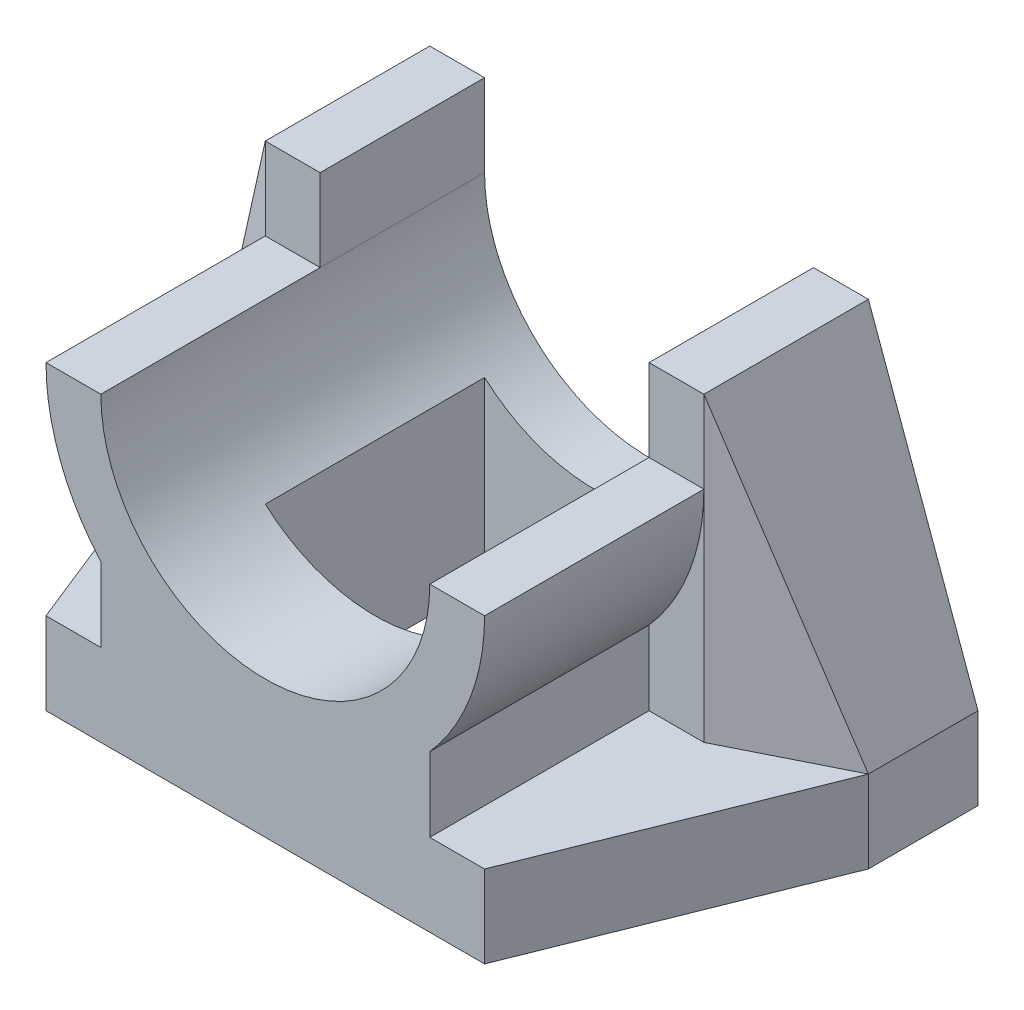
ISO-10303-21;
HEADER;
FILE_DESCRIPTION(('STEP AP214'),'2;1');
FILE_NAME('part.step','',(''),(''),'','','');
FILE_SCHEMA(('AUTOMOTIVE_DESIGN { 1 0 10303 214 1 1 1 1 }'));
ENDSEC;
DATA;
#1=APPLICATION_CONTEXT('core data for automotive mechanical design processes');
#2=APPLICATION_PROTOCOL_DEFINITION('international standard','automotive_design',2000,#1);
#3=PRODUCT_CONTEXT('',#1,'mechanical');
#4=PRODUCT('Part','Part','',(#3));
#5=PRODUCT_RELATED_PRODUCT_CATEGORY('part','',(#4));
#6=PRODUCT_DEFINITION_FORMATION('','',#4);
#7=PRODUCT_DEFINITION_CONTEXT('part definition',#1,'design');
#8=PRODUCT_DEFINITION('design','',#6,#7);
#9=PRODUCT_DEFINITION_SHAPE('','',#8);
#10=(LENGTH_UNIT() NAMED_UNIT(*) SI_UNIT(.MILLI.,.METRE.));
#11=(NAMED_UNIT(*) PLANE_ANGLE_UNIT() SI_UNIT($,.RADIAN.));
#12=(NAMED_UNIT(*) SI_UNIT($,.STERADIAN.) SOLID_ANGLE_UNIT());
#13=UNCERTAINTY_MEASURE_WITH_UNIT(LENGTH_MEASURE(1.E-05),#10,'distance_accuracy_value','');
#14=(GEOMETRIC_REPRESENTATION_CONTEXT(3) GLOBAL_UNCERTAINTY_ASSIGNED_CONTEXT((#13)) GLOBAL_UNIT_ASSIGNED_CONTEXT((#10,
#11,#12)) REPRESENTATION_CONTEXT('',''));
#15=CARTESIAN_POINT('',(0.,0.,0.));
#16=DIRECTION('',(0.,0.,1.));
#17=DIRECTION('',(1.,0.,0.));
#18=AXIS2_PLACEMENT_3D('',#15,#16,#17);
#19=CARTESIAN_POINT('',(0.,0.,0.));
#20=DIRECTION('',(0.,-1.,0.));
#21=DIRECTION('',(0.,0.,-1.));
#22=AXIS2_PLACEMENT_3D('',#19,#20,#21);
#23=PLANE('',#22);
#24=DIRECTION('',(0.371390676354104,0.,-0.928476690885259));
#25=VECTOR('',#24,1.);
#26=CARTESIAN_POINT('',(60.,0.,20.));
#27=LINE('',#26,#25);
#28=CARTESIAN_POINT('',(40.,0.,70.));
#29=VERTEX_POINT('',#28);
#30=CARTESIAN_POINT('',(60.,0.,20.));
#31=VERTEX_POINT('',#30);
#32=EDGE_CURVE('E379',#29,#31,#27,.T.);
#33=ORIENTED_EDGE('',*,*,#32,.F.);
#34=DIRECTION('',(1.,0.,0.));
#35=VECTOR('',#34,1.);
#36=CARTESIAN_POINT('',(40.,0.,70.));
#37=LINE('',#36,#35);
#38=CARTESIAN_POINT('',(-40.,0.,70.));
#39=VERTEX_POINT('',#38);
#40=EDGE_CURVE('E483',#39,#29,#37,.T.);
#41=ORIENTED_EDGE('',*,*,#40,.F.);
#42=DIRECTION('',(-0.371390676354104,0.,-0.928476690885259));
#43=VECTOR('',#42,1.);
#44=CARTESIAN_POINT('',(-60.,0.,20.));
#45=LINE('',#44,#43);
#46=CARTESIAN_POINT('',(-60.,0.,20.));
#47=VERTEX_POINT('',#46);
#48=EDGE_CURVE('E426',#39,#47,#45,.T.);
#49=ORIENTED_EDGE('',*,*,#48,.T.);
#50=DIRECTION('',(0.,0.,1.));
#51=VECTOR('',#50,1.);
#52=CARTESIAN_POINT('',(-60.,0.,70.));
#53=LINE('',#52,#51);
#54=CARTESIAN_POINT('',(-60.,0.,0.));
#55=VERTEX_POINT('',#54);
#56=EDGE_CURVE('E447',#55,#47,#53,.T.);
#57=ORIENTED_EDGE('',*,*,#56,.F.);
#58=DIRECTION('',(-1.,0.,0.));
#59=VECTOR('',#58,1.);
#60=CARTESIAN_POINT('',(-40.,0.,0.));
#61=LINE('',#60,#59);
#62=CARTESIAN_POINT('',(60.,0.,0.));
#63=VERTEX_POINT('',#62);
#64=EDGE_CURVE('E489',#63,#55,#61,.T.);
#65=ORIENTED_EDGE('',*,*,#64,.F.);
#66=DIRECTION('',(0.,0.,1.));
#67=VECTOR('',#66,1.);
#68=CARTESIAN_POINT('',(60.,0.,70.));
#69=LINE('',#68,#67);
#70=EDGE_CURVE('E406',#63,#31,#69,.T.);
#71=ORIENTED_EDGE('',*,*,#70,.T.);
#72=EDGE_LOOP('',(#33,#41,#49,#57,#65,#71));
#73=FACE_BOUND('',#72,.T.);
#74=DIRECTION('',(1.,0.,0.));
#75=VECTOR('',#74,1.);
#76=CARTESIAN_POINT('',(0.,0.,10.));
#77=LINE('',#76,#75);
#78=CARTESIAN_POINT('',(20.,0.,10.));
#79=VERTEX_POINT('',#78);
#80=CARTESIAN_POINT('',(-20.,0.,10.));
#81=VERTEX_POINT('',#80);
#82=EDGE_CURVE('E508',#79,#81,#77,.F.);
#83=ORIENTED_EDGE('',*,*,#82,.T.);
#84=DIRECTION('',(0.,0.,-1.));
#85=VECTOR('',#84,1.);
#86=CARTESIAN_POINT('',(-20.,0.,0.));
#87=LINE('',#86,#85);
#88=CARTESIAN_POINT('',(-20.,0.,50.));
#89=VERTEX_POINT('',#88);
#90=EDGE_CURVE('E44',#81,#89,#87,.F.);
#91=ORIENTED_EDGE('',*,*,#90,.T.);
#92=DIRECTION('',(1.,0.,0.));
#93=VECTOR('',#92,1.);
#94=CARTESIAN_POINT('',(0.,0.,50.));
#95=LINE('',#94,#93);
#96=CARTESIAN_POINT('',(20.,0.,50.));
#97=VERTEX_POINT('',#96);
#98=EDGE_CURVE('E505',#89,#97,#95,.T.);
#99=ORIENTED_EDGE('',*,*,#98,.T.);
#100=DIRECTION('',(0.,0.,-1.));
#101=VECTOR('',#100,1.);
#102=CARTESIAN_POINT('',(20.,0.,0.));
#103=LINE('',#102,#101);
#104=EDGE_CURVE('E58',#97,#79,#103,.T.);
#105=ORIENTED_EDGE('',*,*,#104,.T.);
#106=EDGE_LOOP('',(#83,#91,#99,#105));
#107=FACE_BOUND('',#106,.T.);
#108=ADVANCED_FACE('F41',(#73,#107),#23,.T.);
#109=CARTESIAN_POINT('',(40.,55.,70.));
#110=DIRECTION('',(0.,-1.,0.));
#111=DIRECTION('',(0.,0.,-1.));
#112=AXIS2_PLACEMENT_3D('',#109,#110,#111);
#113=PLANE('',#112);
#114=DIRECTION('',(0.,0.,-1.));
#115=VECTOR('',#114,1.);
#116=CARTESIAN_POINT('',(-30.,55.,70.));
#117=LINE('',#116,#115);
#118=CARTESIAN_POINT('',(-30.,55.,70.));
#119=VERTEX_POINT('',#118);
#120=CARTESIAN_POINT('',(-30.,55.,30.));
#121=VERTEX_POINT('',#120);
#122=EDGE_CURVE('E528',#119,#121,#117,.T.);
#123=ORIENTED_EDGE('',*,*,#122,.T.);
#124=DIRECTION('',(1.,0.,0.));
#125=VECTOR('',#124,1.);
#126=CARTESIAN_POINT('',(-40.,55.,30.));
#127=LINE('',#126,#125);
#128=CARTESIAN_POINT('',(-40.,55.,30.));
#129=VERTEX_POINT('',#128);
#130=EDGE_CURVE('E234',#129,#121,#127,.T.);
#131=ORIENTED_EDGE('',*,*,#130,.F.);
#132=DIRECTION('',(0.,0.,-1.));
#133=VECTOR('',#132,1.);
#134=CARTESIAN_POINT('',(-40.,55.,70.));
#135=LINE('',#134,#133);
#136=CARTESIAN_POINT('',(-40.,55.,70.));
#137=VERTEX_POINT('',#136);
#138=EDGE_CURVE('E468',#137,#129,#135,.T.);
#139=ORIENTED_EDGE('',*,*,#138,.F.);
#140=DIRECTION('',(-1.,0.,0.));
#141=VECTOR('',#140,1.);
#142=CARTESIAN_POINT('',(40.,55.,70.));
#143=LINE('',#142,#141);
#144=EDGE_CURVE('E459',#119,#137,#143,.T.);
#145=ORIENTED_EDGE('',*,*,#144,.F.);
#146=EDGE_LOOP('',(#123,#131,#139,#145));
#147=FACE_BOUND('',#146,.T.);
#148=ADVANCED_FACE('F273',(#147),#113,.F.);
#149=DIRECTION('',(0.,0.,-1.));
#150=VECTOR('',#149,1.);
#151=CARTESIAN_POINT('',(30.,55.,70.));
#152=LINE('',#151,#150);
#153=CARTESIAN_POINT('',(30.,55.,70.));
#154=VERTEX_POINT('',#153);
#155=CARTESIAN_POINT('',(30.,55.,30.));
#156=VERTEX_POINT('',#155);
#157=EDGE_CURVE('E521',#154,#156,#152,.T.);
#158=ORIENTED_EDGE('',*,*,#157,.F.);
#159=CARTESIAN_POINT('',(40.,55.,70.));
#160=VERTEX_POINT('',#159);
#161=EDGE_CURVE('E458',#160,#154,#143,.T.);
#162=ORIENTED_EDGE('',*,*,#161,.F.);
#163=DIRECTION('',(0.,0.,-1.));
#164=VECTOR('',#163,1.);
#165=CARTESIAN_POINT('',(40.,55.,70.));
#166=LINE('',#165,#164);
#167=CARTESIAN_POINT('',(40.,55.,30.));
#168=VERTEX_POINT('',#167);
#169=EDGE_CURVE('E473',#160,#168,#166,.T.);
#170=ORIENTED_EDGE('',*,*,#169,.T.);
#171=DIRECTION('',(-1.,0.,0.));
#172=VECTOR('',#171,1.);
#173=CARTESIAN_POINT('',(40.,55.,30.));
#174=LINE('',#173,#172);
#175=EDGE_CURVE('E243',#168,#156,#174,.T.);
#176=ORIENTED_EDGE('',*,*,#175,.T.);
#177=EDGE_LOOP('',(#158,#162,#170,#176));
#178=FACE_BOUND('',#177,.T.);
#179=ADVANCED_FACE('F271',(#178),#113,.F.);
#180=CARTESIAN_POINT('',(-40.,15.,0.));
#181=DIRECTION('',(0.,0.,1.));
#182=DIRECTION('',(1.,0.,0.));
#183=AXIS2_PLACEMENT_3D('',#180,#181,#182);
#184=PLANE('',#183);
#185=DIRECTION('',(0.,1.,0.));
#186=VECTOR('',#185,1.);
#187=CARTESIAN_POINT('',(-30.,55.,0.));
#188=LINE('',#187,#186);
#189=CARTESIAN_POINT('',(-30.,55.,-6.E-06));
#190=VERTEX_POINT('',#189);
#191=CARTESIAN_POINT('',(-30.,70.,0.));
#192=VERTEX_POINT('',#191);
#193=EDGE_CURVE('E207',#190,#192,#188,.T.);
#194=ORIENTED_EDGE('',*,*,#193,.F.);
#195=CARTESIAN_POINT('',(-30.,55.,0.));
#196=CARTESIAN_POINT('',(-30.,52.0455229689366,0.));
#197=CARTESIAN_POINT('',(-29.4235584120969,49.1472903395161,0.));
#198=CARTESIAN_POINT('',(-28.8472699521832,46.2498276068982,0.));
#199=CARTESIAN_POINT('',(-27.7163859753386,43.5194970290473,0.));
#200=CARTESIAN_POINT('',(-26.585903799089,40.7901365316584,0.));
#201=CARTESIAN_POINT('',(-24.9440883690764,38.3328930094119,0.));
#202=CARTESIAN_POINT('',(-23.3028562725141,35.876522540443,0.));
#203=CARTESIAN_POINT('',(-21.2132034355964,33.7867965644036,0.));
#204=CARTESIAN_POINT('',(-19.1242930477724,31.697813063444,0.));
#205=CARTESIAN_POINT('',(-16.6671069905881,30.0559116309236,0.));
#206=CARTESIAN_POINT('',(-14.2107939662506,28.4145935624012,0.));
#207=CARTESIAN_POINT('',(-11.4805029709527,27.2836140246614,0.));
#208=CARTESIAN_POINT('',(-8.7511820421152,26.1530363214948,0.));
#209=CARTESIAN_POINT('',(-5.85270966048385,25.5764415879031,0.));
#210=CARTESIAN_POINT('',(-2.95526709986776,25.0000517171824,0.));
#211=CARTESIAN_POINT('',(0.,25.,0.));
#212=CARTESIAN_POINT('',(2.95421709981448,24.9999483011926,0.));
#213=CARTESIAN_POINT('',(5.85270966048386,25.5764415879031,0.));
#214=CARTESIAN_POINT('',(8.75017239304619,26.1527300478018,0.));
#215=CARTESIAN_POINT('',(11.4805029709527,27.2836140246614,0.));
#216=CARTESIAN_POINT('',(14.2098634683098,28.4140962008898,0.));
#217=CARTESIAN_POINT('',(16.6671069905881,30.0559116309236,0.));
#218=CARTESIAN_POINT('',(19.123477459557,31.6971437274859,0.));
#219=CARTESIAN_POINT('',(21.2132034355964,33.7867965644036,0.));
#220=CARTESIAN_POINT('',(23.3021869365268,35.8757069521983,0.));
#221=CARTESIAN_POINT('',(24.9440883690764,38.3328930094119,0.));
#222=CARTESIAN_POINT('',(26.5854064375936,40.7892060337271,0.));
#223=CARTESIAN_POINT('',(27.7163859753386,43.5194970290473,0.));
#224=CARTESIAN_POINT('',(28.8469636785614,46.2488179580303,0.));
#225=CARTESIAN_POINT('',(29.4235584120969,49.1472903395162,0.));
#226=CARTESIAN_POINT('',(30.,52.0449928763259,0.));
#227=CARTESIAN_POINT('',(30.,55.,0.));
#228=B_SPLINE_CURVE_WITH_KNOTS('',2,(#195,#196,#197,#198,#199,#200,#201,#202,#203,#204,#205,
#206,#207,#208,#209,#210,#211,#212,#213,#214,#215,#216,#217,#218,#219,#220,#221,#222,#223,#224,
#225,#226,#227),.UNSPECIFIED.,.F.,.F.,(3,2,2,2,2,2,2,2,2,2,2,2,2,2,2,2,3),(0.,0.0625,0.125,
0.1875,0.25,0.3125,0.375,0.4375,0.5,0.5625,0.625,0.6875,0.75,0.8125,0.875,0.9375,1.),.UNSPECIFIED.);
#229=CARTESIAN_POINT('',(30.,55.,-6.E-06));
#230=VERTEX_POINT('',#229);
#231=EDGE_CURVE('E258',#190,#230,#228,.T.);
#232=ORIENTED_EDGE('',*,*,#231,.T.);
#233=DIRECTION('',(0.,1.,0.));
#234=VECTOR('',#233,1.);
#235=CARTESIAN_POINT('',(30.,15.,0.));
#236=LINE('',#235,#234);
#237=CARTESIAN_POINT('',(30.,70.,0.));
#238=VERTEX_POINT('',#237);
#239=EDGE_CURVE('E252',#230,#238,#236,.T.);
#240=ORIENTED_EDGE('',*,*,#239,.T.);
#241=DIRECTION('',(1.,0.,0.));
#242=VECTOR('',#241,1.);
#243=CARTESIAN_POINT('',(30.,70.,0.));
#244=LINE('',#243,#242);
#245=CARTESIAN_POINT('',(40.,70.,0.));
#246=VERTEX_POINT('',#245);
#247=EDGE_CURVE('E249',#238,#246,#244,.T.);
#248=ORIENTED_EDGE('',*,*,#247,.T.);
#249=DIRECTION('',(0.341743063086704,-0.939793423488437,0.));
#250=VECTOR('',#249,1.);
#251=CARTESIAN_POINT('',(60.,15.,0.));
#252=LINE('',#251,#250);
#253=CARTESIAN_POINT('',(60.,15.,0.));
#254=VERTEX_POINT('',#253);
#255=EDGE_CURVE('E387',#246,#254,#252,.T.);
#256=ORIENTED_EDGE('',*,*,#255,.T.);
#257=DIRECTION('',(0.,-1.,0.));
#258=VECTOR('',#257,1.);
#259=CARTESIAN_POINT('',(60.,15.,0.));
#260=LINE('',#259,#258);
#261=EDGE_CURVE('E410',#254,#63,#260,.T.);
#262=ORIENTED_EDGE('',*,*,#261,.T.);
#263=ORIENTED_EDGE('',*,*,#64,.T.);
#264=DIRECTION('',(0.,-1.,0.));
#265=VECTOR('',#264,1.);
#266=CARTESIAN_POINT('',(-60.,15.,0.));
#267=LINE('',#266,#265);
#268=CARTESIAN_POINT('',(-60.,15.,0.));
#269=VERTEX_POINT('',#268);
#270=EDGE_CURVE('E446',#269,#55,#267,.T.);
#271=ORIENTED_EDGE('',*,*,#270,.F.);
#272=DIRECTION('',(-0.341743063086704,-0.939793423488437,0.));
#273=VECTOR('',#272,1.);
#274=CARTESIAN_POINT('',(-60.,15.,0.));
#275=LINE('',#274,#273);
#276=CARTESIAN_POINT('',(-40.,70.,0.));
#277=VERTEX_POINT('',#276);
#278=EDGE_CURVE('E233',#277,#269,#275,.T.);
#279=ORIENTED_EDGE('',*,*,#278,.F.);
#280=DIRECTION('',(-1.,0.,0.));
#281=VECTOR('',#280,1.);
#282=CARTESIAN_POINT('',(-30.,70.,0.));
#283=LINE('',#282,#281);
#284=EDGE_CURVE('E218',#192,#277,#283,.T.);
#285=ORIENTED_EDGE('',*,*,#284,.F.);
#286=EDGE_LOOP('',(#194,#232,#240,#248,#256,#262,#263,#271,#279,#285));
#287=FACE_BOUND('',#286,.T.);
#288=ADVANCED_FACE('F232',(#287),#184,.F.);
#289=CARTESIAN_POINT('',(0.,0.,30.));
#290=DIRECTION('',(0.,0.,1.));
#291=DIRECTION('',(-1.,0.,0.));
#292=AXIS2_PLACEMENT_3D('',#289,#290,#291);
#293=PLANE('',#292);
#294=DIRECTION('',(0.,-1.,0.));
#295=VECTOR('',#294,1.);
#296=CARTESIAN_POINT('',(40.,75.,30.));
#297=LINE('',#296,#295);
#298=CARTESIAN_POINT('',(40.,70.,30.));
#299=VERTEX_POINT('',#298);
#300=EDGE_CURVE('E376',#299,#168,#297,.T.);
#301=ORIENTED_EDGE('',*,*,#300,.F.);
#302=DIRECTION('',(1.,0.,0.));
#303=VECTOR('',#302,1.);
#304=CARTESIAN_POINT('',(30.,70.,30.));
#305=LINE('',#304,#303);
#306=CARTESIAN_POINT('',(30.,70.,30.));
#307=VERTEX_POINT('',#306);
#308=EDGE_CURVE('E397',#307,#299,#305,.T.);
#309=ORIENTED_EDGE('',*,*,#308,.F.);
#310=DIRECTION('',(0.,1.,0.));
#311=VECTOR('',#310,1.);
#312=CARTESIAN_POINT('',(30.,55.,30.));
#313=LINE('',#312,#311);
#314=EDGE_CURVE('E399',#156,#307,#313,.T.);
#315=ORIENTED_EDGE('',*,*,#314,.F.);
#316=ORIENTED_EDGE('',*,*,#175,.F.);
#317=EDGE_LOOP('',(#301,#309,#315,#316));
#318=FACE_BOUND('',#317,.T.);
#319=ADVANCED_FACE('F269',(#318),#293,.T.);
#320=CARTESIAN_POINT('',(40.,15.,70.));
#321=DIRECTION('',(0.,0.,-1.));
#322=DIRECTION('',(-1.,0.,0.));
#323=AXIS2_PLACEMENT_3D('',#320,#321,#322);
#324=PLANE('',#323);
#325=CARTESIAN_POINT('',(0.,55.,70.));
#326=DIRECTION('',(0.,0.,1.));
#327=DIRECTION('',(1.,0.,0.));
#328=AXIS2_PLACEMENT_3D('',#325,#326,#327);
#329=CIRCLE('',#328,30.);
#330=EDGE_CURVE('E523',#119,#154,#329,.T.);
#331=ORIENTED_EDGE('',*,*,#330,.F.);
#332=ORIENTED_EDGE('',*,*,#144,.T.);
#333=CARTESIAN_POINT('',(0.,55.,70.));
#334=DIRECTION('',(0.,0.,1.));
#335=DIRECTION('',(1.,0.,0.));
#336=AXIS2_PLACEMENT_3D('',#333,#334,#335);
#337=CIRCLE('',#336,40.);
#338=CARTESIAN_POINT('',(-30.,28.5424868893541,70.));
#339=VERTEX_POINT('',#338);
#340=EDGE_CURVE('E464',#137,#339,#337,.T.);
#341=ORIENTED_EDGE('',*,*,#340,.T.);
#342=DIRECTION('',(0.,-1.,0.));
#343=VECTOR('',#342,1.);
#344=CARTESIAN_POINT('',(-30.,28.5424868893541,70.));
#345=LINE('',#344,#343);
#346=CARTESIAN_POINT('',(-30.,15.,70.));
#347=VERTEX_POINT('',#346);
#348=EDGE_CURVE('E455',#339,#347,#345,.T.);
#349=ORIENTED_EDGE('',*,*,#348,.T.);
#350=DIRECTION('',(1.,0.,0.));
#351=VECTOR('',#350,1.);
#352=CARTESIAN_POINT('',(40.,15.,70.));
#353=LINE('',#352,#351);
#354=CARTESIAN_POINT('',(-40.,15.,70.));
#355=VERTEX_POINT('',#354);
#356=EDGE_CURVE('E482',#355,#347,#353,.T.);
#357=ORIENTED_EDGE('',*,*,#356,.F.);
#358=DIRECTION('',(0.,-1.,0.));
#359=VECTOR('',#358,1.);
#360=CARTESIAN_POINT('',(-40.,15.,70.));
#361=LINE('',#360,#359);
#362=EDGE_CURVE('E429',#355,#39,#361,.T.);
#363=ORIENTED_EDGE('',*,*,#362,.T.);
#364=ORIENTED_EDGE('',*,*,#40,.T.);
#365=DIRECTION('',(0.,-1.,0.));
#366=VECTOR('',#365,1.);
#367=CARTESIAN_POINT('',(40.,15.,70.));
#368=LINE('',#367,#366);
#369=CARTESIAN_POINT('',(40.,15.,70.));
#370=VERTEX_POINT('',#369);
#371=EDGE_CURVE('E377',#370,#29,#368,.T.);
#372=ORIENTED_EDGE('',*,*,#371,.F.);
#373=CARTESIAN_POINT('',(30.,15.,70.));
#374=VERTEX_POINT('',#373);
#375=EDGE_CURVE('E490',#374,#370,#353,.T.);
#376=ORIENTED_EDGE('',*,*,#375,.F.);
#377=DIRECTION('',(0.,1.,0.));
#378=VECTOR('',#377,1.);
#379=CARTESIAN_POINT('',(30.,15.,70.));
#380=LINE('',#379,#378);
#381=CARTESIAN_POINT('',(30.,28.5424868893541,70.));
#382=VERTEX_POINT('',#381);
#383=EDGE_CURVE('E451',#374,#382,#380,.T.);
#384=ORIENTED_EDGE('',*,*,#383,.T.);
#385=CARTESIAN_POINT('',(0.,55.,70.));
#386=DIRECTION('',(0.,0.,1.));
#387=DIRECTION('',(1.,0.,0.));
#388=AXIS2_PLACEMENT_3D('',#385,#386,#387);
#389=CIRCLE('',#388,40.);
#390=EDGE_CURVE('E460',#382,#160,#389,.T.);
#391=ORIENTED_EDGE('',*,*,#390,.T.);
#392=ORIENTED_EDGE('',*,*,#161,.T.);
#393=EDGE_LOOP('',(#331,#332,#341,#349,#357,#363,#364,#372,#376,#384,#391,#392));
#394=FACE_BOUND('',#393,.T.);
#395=ADVANCED_FACE('F43',(#394),#324,.F.);
#396=CARTESIAN_POINT('',(60.,15.,70.));
#397=DIRECTION('',(1.,0.,0.));
#398=DIRECTION('',(0.,0.,-1.));
#399=AXIS2_PLACEMENT_3D('',#396,#397,#398);
#400=PLANE('',#399);
#401=DIRECTION('',(0.,0.,1.));
#402=VECTOR('',#401,1.);
#403=CARTESIAN_POINT('',(60.,15.,70.));
#404=LINE('',#403,#402);
#405=CARTESIAN_POINT('',(60.,15.,20.));
#406=VERTEX_POINT('',#405);
#407=EDGE_CURVE('E407',#254,#406,#404,.T.);
#408=ORIENTED_EDGE('',*,*,#407,.T.);
#409=DIRECTION('',(0.,-1.,0.));
#410=VECTOR('',#409,1.);
#411=CARTESIAN_POINT('',(60.,15.,20.));
#412=LINE('',#411,#410);
#413=EDGE_CURVE('E382',#406,#31,#412,.T.);
#414=ORIENTED_EDGE('',*,*,#413,.T.);
#415=ORIENTED_EDGE('',*,*,#70,.F.);
#416=ORIENTED_EDGE('',*,*,#261,.F.);
#417=EDGE_LOOP('',(#408,#414,#415,#416));
#418=FACE_BOUND('',#417,.T.);
#419=ADVANCED_FACE('F314',(#418),#400,.T.);
#420=CARTESIAN_POINT('',(0.,0.,30.));
#421=DIRECTION('',(0.,0.,1.));
#422=DIRECTION('',(1.,0.,0.));
#423=AXIS2_PLACEMENT_3D('',#420,#421,#422);
#424=PLANE('',#423);
#425=DIRECTION('',(-1.,0.,0.));
#426=VECTOR('',#425,1.);
#427=CARTESIAN_POINT('',(-30.,70.,30.));
#428=LINE('',#427,#426);
#429=CARTESIAN_POINT('',(-30.,70.,30.));
#430=VERTEX_POINT('',#429);
#431=CARTESIAN_POINT('',(-40.,70.,30.));
#432=VERTEX_POINT('',#431);
#433=EDGE_CURVE('E227',#430,#432,#428,.T.);
#434=ORIENTED_EDGE('',*,*,#433,.T.);
#435=DIRECTION('',(0.,-1.,0.));
#436=VECTOR('',#435,1.);
#437=CARTESIAN_POINT('',(-40.,75.,30.));
#438=LINE('',#437,#436);
#439=EDGE_CURVE('E423',#432,#129,#438,.T.);
#440=ORIENTED_EDGE('',*,*,#439,.T.);
#441=ORIENTED_EDGE('',*,*,#130,.T.);
#442=DIRECTION('',(0.,1.,0.));
#443=VECTOR('',#442,1.);
#444=CARTESIAN_POINT('',(-30.,55.,30.));
#445=LINE('',#444,#443);
#446=EDGE_CURVE('E240',#121,#430,#445,.T.);
#447=ORIENTED_EDGE('',*,*,#446,.T.);
#448=EDGE_LOOP('',(#434,#440,#441,#447));
#449=FACE_BOUND('',#448,.T.);
#450=ADVANCED_FACE('F309',(#449),#424,.T.);
#451=CARTESIAN_POINT('',(0.,55.,30.));
#452=DIRECTION('',(0.,0.,1.));
#453=DIRECTION('',(1.,0.,0.));
#454=AXIS2_PLACEMENT_3D('',#451,#452,#453);
#455=CIRCLE('',#454,40.);
#456=CARTESIAN_POINT('',(-30.,28.5424868893541,30.));
#457=VERTEX_POINT('',#456);
#458=EDGE_CURVE('E219',#129,#457,#455,.T.);
#459=ORIENTED_EDGE('',*,*,#458,.F.);
#460=CARTESIAN_POINT('',(-40.,15.,30.));
#461=VERTEX_POINT('',#460);
#462=EDGE_CURVE('E416',#129,#461,#438,.T.);
#463=ORIENTED_EDGE('',*,*,#462,.T.);
#464=DIRECTION('',(1.,0.,0.));
#465=VECTOR('',#464,1.);
#466=CARTESIAN_POINT('',(-30.,15.,30.));
#467=LINE('',#466,#465);
#468=CARTESIAN_POINT('',(-30.,15.,30.));
#469=VERTEX_POINT('',#468);
#470=EDGE_CURVE('E433',#461,#469,#467,.T.);
#471=ORIENTED_EDGE('',*,*,#470,.T.);
#472=DIRECTION('',(0.,1.,0.));
#473=VECTOR('',#472,1.);
#474=CARTESIAN_POINT('',(-30.,55.,30.));
#475=LINE('',#474,#473);
#476=EDGE_CURVE('E434',#469,#457,#475,.T.);
#477=ORIENTED_EDGE('',*,*,#476,.T.);
#478=EDGE_LOOP('',(#459,#463,#471,#477));
#479=FACE_BOUND('',#478,.T.);
#480=ADVANCED_FACE('F311',(#479),#424,.T.);
#481=CARTESIAN_POINT('',(-60.,15.,30.));
#482=DIRECTION('',(0.939793423488437,-0.341743063086704,0.));
#483=DIRECTION('',(0.341743063086704,0.939793423488437,0.));
#484=AXIS2_PLACEMENT_3D('',#481,#482,#483);
#485=PLANE('',#484);
#486=DIRECTION('',(-0.336860768426608,-0.926367113173171,-0.168430384213304));
#487=VECTOR('',#486,1.);
#488=CARTESIAN_POINT('',(-59.4326241134752,16.5602836879433,20.2836879432624));
#489=LINE('',#488,#487);
#490=CARTESIAN_POINT('',(-60.,15.,20.));
#491=VERTEX_POINT('',#490);
#492=EDGE_CURVE('E486',#432,#491,#489,.T.);
#493=ORIENTED_EDGE('',*,*,#492,.F.);
#494=DIRECTION('',(0.,0.,-1.));
#495=VECTOR('',#494,1.);
#496=CARTESIAN_POINT('',(-40.,70.,30.));
#497=LINE('',#496,#495);
#498=EDGE_CURVE('E229',#432,#277,#497,.T.);
#499=ORIENTED_EDGE('',*,*,#498,.T.);
#500=ORIENTED_EDGE('',*,*,#278,.T.);
#501=DIRECTION('',(0.,0.,1.));
#502=VECTOR('',#501,1.);
#503=CARTESIAN_POINT('',(-60.,15.,70.));
#504=LINE('',#503,#502);
#505=EDGE_CURVE('E444',#269,#491,#504,.T.);
#506=ORIENTED_EDGE('',*,*,#505,.T.);
#507=EDGE_LOOP('',(#493,#499,#500,#506));
#508=FACE_BOUND('',#507,.T.);
#509=ADVANCED_FACE('F278',(#508),#485,.F.);
#510=CARTESIAN_POINT('',(0.,15.,0.));
#511=DIRECTION('',(0.,-1.,0.));
#512=DIRECTION('',(0.,0.,-1.));
#513=AXIS2_PLACEMENT_3D('',#510,#511,#512);
#514=PLANE('',#513);
#515=DIRECTION('',(-0.371390676354104,0.,-0.928476690885259));
#516=VECTOR('',#515,1.);
#517=CARTESIAN_POINT('',(-60.,15.,20.));
#518=LINE('',#517,#516);
#519=EDGE_CURVE('E425',#355,#491,#518,.T.);
#520=ORIENTED_EDGE('',*,*,#519,.F.);
#521=ORIENTED_EDGE('',*,*,#356,.T.);
#522=DIRECTION('',(0.,0.,-1.));
#523=VECTOR('',#522,1.);
#524=CARTESIAN_POINT('',(-30.,15.,70.));
#525=LINE('',#524,#523);
#526=EDGE_CURVE('E477',#347,#469,#525,.T.);
#527=ORIENTED_EDGE('',*,*,#526,.T.);
#528=ORIENTED_EDGE('',*,*,#470,.F.);
#529=DIRECTION('',(-0.894427190999916,0.,-0.447213595499958));
#530=VECTOR('',#529,1.);
#531=CARTESIAN_POINT('',(-60.,15.,20.));
#532=LINE('',#531,#530);
#533=EDGE_CURVE('E411',#461,#491,#532,.T.);
#534=ORIENTED_EDGE('',*,*,#533,.T.);
#535=EDGE_LOOP('',(#520,#521,#527,#528,#534));
#536=FACE_BOUND('',#535,.T.);
#537=ADVANCED_FACE('F277',(#536),#514,.F.);
#538=CARTESIAN_POINT('',(-60.,15.,70.));
#539=DIRECTION('',(1.,0.,0.));
#540=DIRECTION('',(0.,0.,-1.));
#541=AXIS2_PLACEMENT_3D('',#538,#539,#540);
#542=PLANE('',#541);
#543=DIRECTION('',(0.,-1.,0.));
#544=VECTOR('',#543,1.);
#545=CARTESIAN_POINT('',(-60.,15.,20.));
#546=LINE('',#545,#544);
#547=EDGE_CURVE('E422',#491,#47,#546,.T.);
#548=ORIENTED_EDGE('',*,*,#547,.F.);
#549=ORIENTED_EDGE('',*,*,#505,.F.);
#550=ORIENTED_EDGE('',*,*,#270,.T.);
#551=ORIENTED_EDGE('',*,*,#56,.T.);
#552=EDGE_LOOP('',(#548,#549,#550,#551));
#553=FACE_BOUND('',#552,.T.);
#554=ADVANCED_FACE('F276',(#553),#542,.F.);
#555=CARTESIAN_POINT('',(-30.,28.5424868893541,70.));
#556=DIRECTION('',(1.,0.,0.));
#557=DIRECTION('',(0.,0.,-1.));
#558=AXIS2_PLACEMENT_3D('',#555,#556,#557);
#559=PLANE('',#558);
#560=ORIENTED_EDGE('',*,*,#476,.F.);
#561=ORIENTED_EDGE('',*,*,#526,.F.);
#562=ORIENTED_EDGE('',*,*,#348,.F.);
#563=DIRECTION('',(0.,0.,-1.));
#564=VECTOR('',#563,1.);
#565=CARTESIAN_POINT('',(-30.,28.5424868893541,70.));
#566=LINE('',#565,#564);
#567=EDGE_CURVE('E465',#339,#457,#566,.T.);
#568=ORIENTED_EDGE('',*,*,#567,.T.);
#569=EDGE_LOOP('',(#560,#561,#562,#568));
#570=FACE_BOUND('',#569,.T.);
#571=ADVANCED_FACE('F284',(#570),#559,.F.);
#572=ORIENTED_EDGE('',*,*,#375,.T.);
#573=DIRECTION('',(0.371390676354104,0.,-0.928476690885259));
#574=VECTOR('',#573,1.);
#575=CARTESIAN_POINT('',(60.,15.,20.));
#576=LINE('',#575,#574);
#577=EDGE_CURVE('E380',#370,#406,#576,.T.);
#578=ORIENTED_EDGE('',*,*,#577,.T.);
#579=DIRECTION('',(0.894427190999916,0.,-0.447213595499958));
#580=VECTOR('',#579,1.);
#581=CARTESIAN_POINT('',(60.,15.,20.));
#582=LINE('',#581,#580);
#583=CARTESIAN_POINT('',(40.,15.,30.));
#584=VERTEX_POINT('',#583);
#585=EDGE_CURVE('E368',#584,#406,#582,.T.);
#586=ORIENTED_EDGE('',*,*,#585,.F.);
#587=DIRECTION('',(-1.,0.,0.));
#588=VECTOR('',#587,1.);
#589=CARTESIAN_POINT('',(30.,15.,30.));
#590=LINE('',#589,#588);
#591=CARTESIAN_POINT('',(30.,15.,30.));
#592=VERTEX_POINT('',#591);
#593=EDGE_CURVE('E390',#584,#592,#590,.T.);
#594=ORIENTED_EDGE('',*,*,#593,.T.);
#595=DIRECTION('',(0.,0.,-1.));
#596=VECTOR('',#595,1.);
#597=CARTESIAN_POINT('',(30.,15.,70.));
#598=LINE('',#597,#596);
#599=EDGE_CURVE('E480',#374,#592,#598,.T.);
#600=ORIENTED_EDGE('',*,*,#599,.F.);
#601=EDGE_LOOP('',(#572,#578,#586,#594,#600));
#602=FACE_BOUND('',#601,.T.);
#603=ADVANCED_FACE('F282',(#602),#514,.F.);
#604=CARTESIAN_POINT('',(30.,15.,70.));
#605=DIRECTION('',(-1.,0.,0.));
#606=DIRECTION('',(0.,0.,1.));
#607=AXIS2_PLACEMENT_3D('',#604,#605,#606);
#608=PLANE('',#607);
#609=ORIENTED_EDGE('',*,*,#599,.T.);
#610=DIRECTION('',(0.,1.,0.));
#611=VECTOR('',#610,1.);
#612=CARTESIAN_POINT('',(30.,55.,30.));
#613=LINE('',#612,#611);
#614=CARTESIAN_POINT('',(30.,28.5424868893541,30.));
#615=VERTEX_POINT('',#614);
#616=EDGE_CURVE('E386',#592,#615,#613,.T.);
#617=ORIENTED_EDGE('',*,*,#616,.T.);
#618=DIRECTION('',(0.,0.,-1.));
#619=VECTOR('',#618,1.);
#620=CARTESIAN_POINT('',(30.,28.5424868893541,70.));
#621=LINE('',#620,#619);
#622=EDGE_CURVE('E475',#382,#615,#621,.T.);
#623=ORIENTED_EDGE('',*,*,#622,.F.);
#624=ORIENTED_EDGE('',*,*,#383,.F.);
#625=EDGE_LOOP('',(#609,#617,#623,#624));
#626=FACE_BOUND('',#625,.T.);
#627=ADVANCED_FACE('F290',(#626),#608,.F.);
#628=CARTESIAN_POINT('',(0.,55.,70.));
#629=DIRECTION('',(0.,0.,-1.));
#630=DIRECTION('',(-1.,0.,0.));
#631=AXIS2_PLACEMENT_3D('',#628,#629,#630);
#632=CYLINDRICAL_SURFACE('',#631,40.);
#633=ORIENTED_EDGE('',*,*,#622,.T.);
#634=CARTESIAN_POINT('',(0.,55.,30.));
#635=DIRECTION('',(0.,0.,1.));
#636=DIRECTION('',(1.,0.,0.));
#637=AXIS2_PLACEMENT_3D('',#634,#635,#636);
#638=CIRCLE('',#637,40.);
#639=EDGE_CURVE('E251',#615,#168,#638,.T.);
#640=ORIENTED_EDGE('',*,*,#639,.T.);
#641=ORIENTED_EDGE('',*,*,#169,.F.);
#642=ORIENTED_EDGE('',*,*,#390,.F.);
#643=EDGE_LOOP('',(#633,#640,#641,#642));
#644=FACE_BOUND('',#643,.T.);
#645=ADVANCED_FACE('F286',(#644),#632,.T.);
#646=CARTESIAN_POINT('',(0.,55.,70.));
#647=DIRECTION('',(0.,0.,-1.));
#648=DIRECTION('',(-1.,0.,0.));
#649=AXIS2_PLACEMENT_3D('',#646,#647,#648);
#650=CYLINDRICAL_SURFACE('',#649,40.);
#651=ORIENTED_EDGE('',*,*,#138,.T.);
#652=ORIENTED_EDGE('',*,*,#458,.T.);
#653=ORIENTED_EDGE('',*,*,#567,.F.);
#654=ORIENTED_EDGE('',*,*,#340,.F.);
#655=EDGE_LOOP('',(#651,#652,#653,#654));
#656=FACE_BOUND('',#655,.T.);
#657=ADVANCED_FACE('F294',(#656),#650,.T.);
#658=CARTESIAN_POINT('',(-30.,55.,30.));
#659=DIRECTION('',(-1.,0.,0.));
#660=DIRECTION('',(0.,0.,1.));
#661=AXIS2_PLACEMENT_3D('',#658,#659,#660);
#662=PLANE('',#661);
#663=ORIENTED_EDGE('',*,*,#193,.T.);
#664=DIRECTION('',(0.,0.,-1.));
#665=VECTOR('',#664,1.);
#666=CARTESIAN_POINT('',(-30.,70.,30.));
#667=LINE('',#666,#665);
#668=EDGE_CURVE('E213',#430,#192,#667,.T.);
#669=ORIENTED_EDGE('',*,*,#668,.F.);
#670=ORIENTED_EDGE('',*,*,#446,.F.);
#671=DIRECTION('',(0.,0.,-1.));
#672=VECTOR('',#671,1.);
#673=CARTESIAN_POINT('',(-30.,55.,30.));
#674=LINE('',#673,#672);
#675=EDGE_CURVE('E214',#121,#190,#674,.T.);
#676=ORIENTED_EDGE('',*,*,#675,.T.);
#677=EDGE_LOOP('',(#663,#669,#670,#676));
#678=FACE_BOUND('',#677,.T.);
#679=ADVANCED_FACE('F211',(#678),#662,.F.);
#680=CARTESIAN_POINT('',(-30.,70.,30.));
#681=DIRECTION('',(0.,-1.,0.));
#682=DIRECTION('',(0.,0.,-1.));
#683=AXIS2_PLACEMENT_3D('',#680,#681,#682);
#684=PLANE('',#683);
#685=ORIENTED_EDGE('',*,*,#284,.T.);
#686=ORIENTED_EDGE('',*,*,#498,.F.);
#687=ORIENTED_EDGE('',*,*,#433,.F.);
#688=ORIENTED_EDGE('',*,*,#668,.T.);
#689=EDGE_LOOP('',(#685,#686,#687,#688));
#690=FACE_BOUND('',#689,.T.);
#691=ADVANCED_FACE('F221',(#690),#684,.F.);
#692=CARTESIAN_POINT('',(-60.,15.,20.));
#693=DIRECTION('',(-0.928476690885259,0.,0.371390676354104));
#694=DIRECTION('',(0.371390676354104,0.,0.92847669088526));
#695=AXIS2_PLACEMENT_3D('',#692,#693,#694);
#696=PLANE('',#695);
#697=ORIENTED_EDGE('',*,*,#48,.F.);
#698=ORIENTED_EDGE('',*,*,#362,.F.);
#699=ORIENTED_EDGE('',*,*,#519,.T.);
#700=ORIENTED_EDGE('',*,*,#547,.T.);
#701=EDGE_LOOP('',(#697,#698,#699,#700));
#702=FACE_BOUND('',#701,.T.);
#703=ADVANCED_FACE('F310',(#702),#696,.T.);
#704=CARTESIAN_POINT('',(-60.,75.,20.));
#705=DIRECTION('',(-0.447213595499958,0.,0.894427190999916));
#706=DIRECTION('',(0.894427190999916,0.,0.447213595499958));
#707=AXIS2_PLACEMENT_3D('',#704,#705,#706);
#708=PLANE('',#707);
#709=ORIENTED_EDGE('',*,*,#492,.T.);
#710=ORIENTED_EDGE('',*,*,#533,.F.);
#711=ORIENTED_EDGE('',*,*,#462,.F.);
#712=ORIENTED_EDGE('',*,*,#439,.F.);
#713=EDGE_LOOP('',(#709,#710,#711,#712));
#714=FACE_BOUND('',#713,.T.);
#715=ADVANCED_FACE('F321',(#714),#708,.T.);
#716=CARTESIAN_POINT('',(30.,70.,30.));
#717=DIRECTION('',(0.,1.,0.));
#718=DIRECTION('',(0.,0.,1.));
#719=AXIS2_PLACEMENT_3D('',#716,#717,#718);
#720=PLANE('',#719);
#721=ORIENTED_EDGE('',*,*,#247,.F.);
#722=DIRECTION('',(0.,0.,-1.));
#723=VECTOR('',#722,1.);
#724=CARTESIAN_POINT('',(30.,70.,30.));
#725=LINE('',#724,#723);
#726=EDGE_CURVE('E244',#307,#238,#725,.T.);
#727=ORIENTED_EDGE('',*,*,#726,.F.);
#728=ORIENTED_EDGE('',*,*,#308,.T.);
#729=DIRECTION('',(0.,0.,-1.));
#730=VECTOR('',#729,1.);
#731=CARTESIAN_POINT('',(40.,70.,30.));
#732=LINE('',#731,#730);
#733=EDGE_CURVE('E248',#299,#246,#732,.T.);
#734=ORIENTED_EDGE('',*,*,#733,.T.);
#735=EDGE_LOOP('',(#721,#727,#728,#734));
#736=FACE_BOUND('',#735,.T.);
#737=ADVANCED_FACE('F324',(#736),#720,.T.);
#738=CARTESIAN_POINT('',(30.,55.,30.));
#739=DIRECTION('',(-1.,0.,0.));
#740=DIRECTION('',(0.,0.,1.));
#741=AXIS2_PLACEMENT_3D('',#738,#739,#740);
#742=PLANE('',#741);
#743=ORIENTED_EDGE('',*,*,#239,.F.);
#744=DIRECTION('',(0.,0.,-1.));
#745=VECTOR('',#744,1.);
#746=CARTESIAN_POINT('',(30.,55.,30.));
#747=LINE('',#746,#745);
#748=EDGE_CURVE('E241',#156,#230,#747,.T.);
#749=ORIENTED_EDGE('',*,*,#748,.F.);
#750=ORIENTED_EDGE('',*,*,#314,.T.);
#751=ORIENTED_EDGE('',*,*,#726,.T.);
#752=EDGE_LOOP('',(#743,#749,#750,#751));
#753=FACE_BOUND('',#752,.T.);
#754=ADVANCED_FACE('F335',(#753),#742,.T.);
#755=EDGE_CURVE('E372',#168,#584,#297,.T.);
#756=ORIENTED_EDGE('',*,*,#755,.F.);
#757=ORIENTED_EDGE('',*,*,#639,.F.);
#758=ORIENTED_EDGE('',*,*,#616,.F.);
#759=ORIENTED_EDGE('',*,*,#593,.F.);
#760=EDGE_LOOP('',(#756,#757,#758,#759));
#761=FACE_BOUND('',#760,.T.);
#762=ADVANCED_FACE('F336',(#761),#293,.T.);
#763=CARTESIAN_POINT('',(60.,15.,30.));
#764=DIRECTION('',(0.939793423488437,0.341743063086704,0.));
#765=DIRECTION('',(-0.341743063086704,0.939793423488437,0.));
#766=AXIS2_PLACEMENT_3D('',#763,#764,#765);
#767=PLANE('',#766);
#768=DIRECTION('',(-0.336860768426608,0.926367113173171,0.168430384213304));
#769=VECTOR('',#768,1.);
#770=CARTESIAN_POINT('',(59.4326241134752,16.5602836879433,20.2836879432624));
#771=LINE('',#770,#769);
#772=EDGE_CURVE('E492',#406,#299,#771,.T.);
#773=ORIENTED_EDGE('',*,*,#772,.F.);
#774=ORIENTED_EDGE('',*,*,#407,.F.);
#775=ORIENTED_EDGE('',*,*,#255,.F.);
#776=ORIENTED_EDGE('',*,*,#733,.F.);
#777=EDGE_LOOP('',(#773,#774,#775,#776));
#778=FACE_BOUND('',#777,.T.);
#779=ADVANCED_FACE('F340',(#778),#767,.T.);
#780=CARTESIAN_POINT('',(60.,15.,20.));
#781=DIRECTION('',(-0.928476690885259,0.,-0.371390676354104));
#782=DIRECTION('',(-0.371390676354104,0.,0.92847669088526));
#783=AXIS2_PLACEMENT_3D('',#780,#781,#782);
#784=PLANE('',#783);
#785=ORIENTED_EDGE('',*,*,#32,.T.);
#786=ORIENTED_EDGE('',*,*,#413,.F.);
#787=ORIENTED_EDGE('',*,*,#577,.F.);
#788=ORIENTED_EDGE('',*,*,#371,.T.);
#789=EDGE_LOOP('',(#785,#786,#787,#788));
#790=FACE_BOUND('',#789,.T.);
#791=ADVANCED_FACE('F344',(#790),#784,.F.);
#792=CARTESIAN_POINT('',(60.,75.,20.));
#793=DIRECTION('',(-0.447213595499958,0.,-0.894427190999916));
#794=DIRECTION('',(-0.894427190999916,0.,0.447213595499958));
#795=AXIS2_PLACEMENT_3D('',#792,#793,#794);
#796=PLANE('',#795);
#797=ORIENTED_EDGE('',*,*,#772,.T.);
#798=ORIENTED_EDGE('',*,*,#300,.T.);
#799=ORIENTED_EDGE('',*,*,#755,.T.);
#800=ORIENTED_EDGE('',*,*,#585,.T.);
#801=EDGE_LOOP('',(#797,#798,#799,#800));
#802=FACE_BOUND('',#801,.T.);
#803=ADVANCED_FACE('F346',(#802),#796,.F.);
#804=CARTESIAN_POINT('',(0.,55.,70.));
#805=DIRECTION('',(0.,0.,-1.));
#806=DIRECTION('',(-1.,0.,0.));
#807=AXIS2_PLACEMENT_3D('',#804,#805,#806);
#808=CYLINDRICAL_SURFACE('',#807,30.);
#809=DIRECTION('',(0.,0.,-1.));
#810=VECTOR('',#809,1.);
#811=CARTESIAN_POINT('',(-20.,32.6393202250021,70.));
#812=LINE('',#811,#810);
#813=CARTESIAN_POINT('',(-20.,32.6393202250021,10.));
#814=VERTEX_POINT('',#813);
#815=CARTESIAN_POINT('',(-20.,32.6393202250021,50.));
#816=VERTEX_POINT('',#815);
#817=EDGE_CURVE('E11',#814,#816,#812,.F.);
#818=ORIENTED_EDGE('',*,*,#817,.F.);
#819=CARTESIAN_POINT('',(0.,55.,10.));
#820=DIRECTION('',(0.,0.,-1.));
#821=DIRECTION('',(-1.,0.,0.));
#822=AXIS2_PLACEMENT_3D('',#819,#820,#821);
#823=CIRCLE('',#822,30.);
#824=CARTESIAN_POINT('',(20.,32.6393202250021,10.));
#825=VERTEX_POINT('',#824);
#826=EDGE_CURVE('E51',#825,#814,#823,.T.);
#827=ORIENTED_EDGE('',*,*,#826,.F.);
#828=DIRECTION('',(0.,0.,-1.));
#829=VECTOR('',#828,1.);
#830=CARTESIAN_POINT('',(20.,32.6393202250021,70.));
#831=LINE('',#830,#829);
#832=CARTESIAN_POINT('',(20.,32.6393202250021,50.));
#833=VERTEX_POINT('',#832);
#834=EDGE_CURVE('E499',#833,#825,#831,.T.);
#835=ORIENTED_EDGE('',*,*,#834,.F.);
#836=CARTESIAN_POINT('',(0.,55.,50.));
#837=DIRECTION('',(0.,0.,1.));
#838=DIRECTION('',(1.,0.,0.));
#839=AXIS2_PLACEMENT_3D('',#836,#837,#838);
#840=CIRCLE('',#839,30.);
#841=EDGE_CURVE('E85',#816,#833,#840,.T.);
#842=ORIENTED_EDGE('',*,*,#841,.F.);
#843=EDGE_LOOP('',(#818,#827,#835,#842));
#844=FACE_BOUND('',#843,.T.);
#845=ORIENTED_EDGE('',*,*,#231,.F.);
#846=ORIENTED_EDGE('',*,*,#675,.F.);
#847=ORIENTED_EDGE('',*,*,#122,.F.);
#848=ORIENTED_EDGE('',*,*,#330,.T.);
#849=ORIENTED_EDGE('',*,*,#157,.T.);
#850=ORIENTED_EDGE('',*,*,#748,.T.);
#851=EDGE_LOOP('',(#845,#846,#847,#848,#849,#850));
#852=FACE_BOUND('',#851,.T.);
#853=ADVANCED_FACE('F352',(#844,#852),#808,.F.);
#854=CARTESIAN_POINT('',(-20.,-1.2E-05,50.));
#855=DIRECTION('',(-1.,0.,0.));
#856=DIRECTION('',(0.,0.,1.));
#857=AXIS2_PLACEMENT_3D('',#854,#855,#856);
#858=PLANE('',#857);
#859=ORIENTED_EDGE('',*,*,#817,.T.);
#860=DIRECTION('',(0.,1.,0.));
#861=VECTOR('',#860,1.);
#862=CARTESIAN_POINT('',(-20.,-1.2E-05,50.));
#863=LINE('',#862,#861);
#864=EDGE_CURVE('E506',#89,#816,#863,.T.);
#865=ORIENTED_EDGE('',*,*,#864,.F.);
#866=ORIENTED_EDGE('',*,*,#90,.F.);
#867=DIRECTION('',(0.,1.,0.));
#868=VECTOR('',#867,1.);
#869=CARTESIAN_POINT('',(-20.,-1.2E-05,10.));
#870=LINE('',#869,#868);
#871=EDGE_CURVE('E73',#81,#814,#870,.T.);
#872=ORIENTED_EDGE('',*,*,#871,.T.);
#873=EDGE_LOOP('',(#859,#865,#866,#872));
#874=FACE_BOUND('',#873,.T.);
#875=ADVANCED_FACE('F360',(#874),#858,.F.);
#876=CARTESIAN_POINT('',(-20.,-1.2E-05,10.));
#877=DIRECTION('',(0.,0.,-1.));
#878=DIRECTION('',(-1.,0.,0.));
#879=AXIS2_PLACEMENT_3D('',#876,#877,#878);
#880=PLANE('',#879);
#881=ORIENTED_EDGE('',*,*,#826,.T.);
#882=ORIENTED_EDGE('',*,*,#871,.F.);
#883=ORIENTED_EDGE('',*,*,#82,.F.);
#884=DIRECTION('',(0.,1.,0.));
#885=VECTOR('',#884,1.);
#886=CARTESIAN_POINT('',(20.,-1.2E-05,10.));
#887=LINE('',#886,#885);
#888=EDGE_CURVE('E517',#79,#825,#887,.T.);
#889=ORIENTED_EDGE('',*,*,#888,.T.);
#890=EDGE_LOOP('',(#881,#882,#883,#889));
#891=FACE_BOUND('',#890,.T.);
#892=ADVANCED_FACE('F723',(#891),#880,.F.);
#893=CARTESIAN_POINT('',(20.,-1.2E-05,10.));
#894=DIRECTION('',(1.,0.,0.));
#895=DIRECTION('',(0.,0.,-1.));
#896=AXIS2_PLACEMENT_3D('',#893,#894,#895);
#897=PLANE('',#896);
#898=ORIENTED_EDGE('',*,*,#834,.T.);
#899=ORIENTED_EDGE('',*,*,#888,.F.);
#900=ORIENTED_EDGE('',*,*,#104,.F.);
#901=DIRECTION('',(0.,1.,0.));
#902=VECTOR('',#901,1.);
#903=CARTESIAN_POINT('',(20.,-1.2E-05,50.));
#904=LINE('',#903,#902);
#905=EDGE_CURVE('E511',#97,#833,#904,.T.);
#906=ORIENTED_EDGE('',*,*,#905,.T.);
#907=EDGE_LOOP('',(#898,#899,#900,#906));
#908=FACE_BOUND('',#907,.T.);
#909=ADVANCED_FACE('F732',(#908),#897,.F.);
#910=CARTESIAN_POINT('',(20.,-1.2E-05,50.));
#911=DIRECTION('',(0.,0.,1.));
#912=DIRECTION('',(1.,0.,0.));
#913=AXIS2_PLACEMENT_3D('',#910,#911,#912);
#914=PLANE('',#913);
#915=ORIENTED_EDGE('',*,*,#841,.T.);
#916=ORIENTED_EDGE('',*,*,#905,.F.);
#917=ORIENTED_EDGE('',*,*,#98,.F.);
#918=ORIENTED_EDGE('',*,*,#864,.T.);
#919=EDGE_LOOP('',(#915,#916,#917,#918));
#920=FACE_BOUND('',#919,.T.);
#921=ADVANCED_FACE('F738',(#920),#914,.F.);
#922=CLOSED_SHELL('',(#108,#148,#179,#288,#319,#395,#419,#450,#480,#509,#537,#554,#571,#603,
#627,#645,#657,#679,#691,#703,#715,#737,#754,#762,#779,#791,#803,#853,#875,#892,#909,#921));
#923=MANIFOLD_SOLID_BREP('B2',#922);
#924=ADVANCED_BREP_SHAPE_REPRESENTATION('',(#18,#923),#14);
#925=SHAPE_DEFINITION_REPRESENTATION(#9,#924);
ENDSEC;
END-ISO-10303-21;
